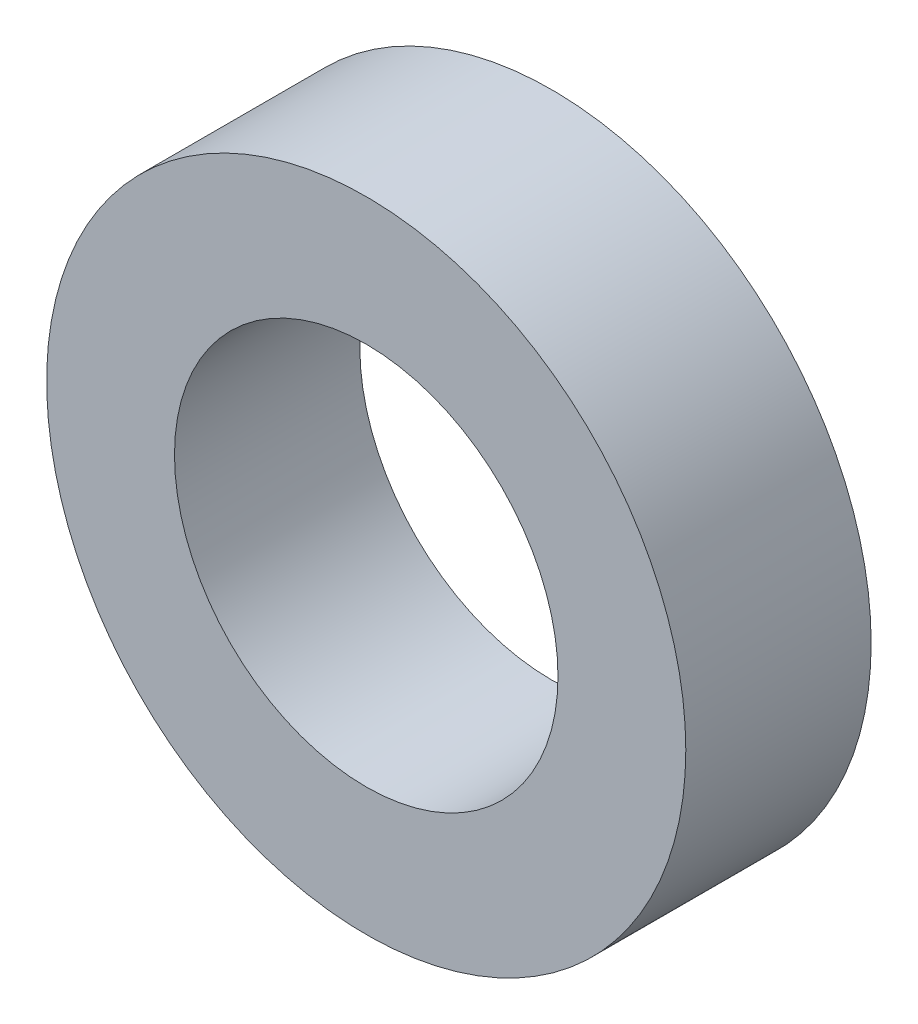
ISO-10303-21;
HEADER;
FILE_DESCRIPTION(('STEP AP214'),'2;1');
FILE_NAME('part.step','',(''),(''),'','','');
FILE_SCHEMA(('AUTOMOTIVE_DESIGN { 1 0 10303 214 1 1 1 1 }'));
ENDSEC;
DATA;
#1=APPLICATION_CONTEXT('core data for automotive mechanical design processes');
#2=APPLICATION_PROTOCOL_DEFINITION('international standard','automotive_design',2000,#1);
#3=PRODUCT_CONTEXT('',#1,'mechanical');
#4=PRODUCT('Part','Part','',(#3));
#5=PRODUCT_RELATED_PRODUCT_CATEGORY('part','',(#4));
#6=PRODUCT_DEFINITION_FORMATION('','',#4);
#7=PRODUCT_DEFINITION_CONTEXT('part definition',#1,'design');
#8=PRODUCT_DEFINITION('design','',#6,#7);
#9=PRODUCT_DEFINITION_SHAPE('','',#8);
#10=(LENGTH_UNIT() NAMED_UNIT(*) SI_UNIT(.MILLI.,.METRE.));
#11=(NAMED_UNIT(*) PLANE_ANGLE_UNIT() SI_UNIT($,.RADIAN.));
#12=(NAMED_UNIT(*) SI_UNIT($,.STERADIAN.) SOLID_ANGLE_UNIT());
#13=UNCERTAINTY_MEASURE_WITH_UNIT(LENGTH_MEASURE(1.E-05),#10,'distance_accuracy_value','');
#14=(GEOMETRIC_REPRESENTATION_CONTEXT(3) GLOBAL_UNCERTAINTY_ASSIGNED_CONTEXT((#13)) GLOBAL_UNIT_ASSIGNED_CONTEXT((#10,
#11,#12)) REPRESENTATION_CONTEXT('',''));
#15=CARTESIAN_POINT('',(0.,0.,0.));
#16=DIRECTION('',(0.,0.,1.));
#17=DIRECTION('',(1.,0.,0.));
#18=AXIS2_PLACEMENT_3D('',#15,#16,#17);
#19=CARTESIAN_POINT('',(0.,0.,2.9));
#20=DIRECTION('',(0.,0.,1.));
#21=DIRECTION('',(1.,0.,0.));
#22=AXIS2_PLACEMENT_3D('',#19,#20,#21);
#23=PLANE('',#22);
#24=CARTESIAN_POINT('',(0.,0.,2.9));
#25=DIRECTION('',(0.,0.,1.));
#26=DIRECTION('',(1.,0.,0.));
#27=AXIS2_PLACEMENT_3D('',#24,#25,#26);
#28=CIRCLE('',#27,5.);
#29=CARTESIAN_POINT('',(5.,0.,2.9));
#30=VERTEX_POINT('',#29);
#31=EDGE_CURVE('E10',#30,#30,#28,.T.);
#32=ORIENTED_EDGE('',*,*,#31,.T.);
#33=EDGE_LOOP('',(#32));
#34=FACE_BOUND('',#33,.T.);
#35=CARTESIAN_POINT('',(0.,0.,2.9));
#36=DIRECTION('',(0.,0.,1.));
#37=DIRECTION('',(1.,0.,0.));
#38=AXIS2_PLACEMENT_3D('',#35,#36,#37);
#39=CIRCLE('',#38,3.);
#40=CARTESIAN_POINT('',(3.,0.,2.9));
#41=VERTEX_POINT('',#40);
#42=EDGE_CURVE('E42',#41,#41,#39,.T.);
#43=ORIENTED_EDGE('',*,*,#42,.F.);
#44=EDGE_LOOP('',(#43));
#45=FACE_BOUND('',#44,.T.);
#46=ADVANCED_FACE('F31',(#34,#45),#23,.T.);
#47=CARTESIAN_POINT('',(0.,0.,0.));
#48=DIRECTION('',(0.,0.,1.));
#49=DIRECTION('',(1.,0.,0.));
#50=AXIS2_PLACEMENT_3D('',#47,#48,#49);
#51=PLANE('',#50);
#52=CARTESIAN_POINT('',(0.,0.,0.));
#53=DIRECTION('',(0.,0.,1.));
#54=DIRECTION('',(1.,0.,0.));
#55=AXIS2_PLACEMENT_3D('',#52,#53,#54);
#56=CIRCLE('',#55,5.);
#57=CARTESIAN_POINT('',(5.,0.,0.));
#58=VERTEX_POINT('',#57);
#59=EDGE_CURVE('E35',#58,#58,#56,.T.);
#60=ORIENTED_EDGE('',*,*,#59,.F.);
#61=EDGE_LOOP('',(#60));
#62=FACE_BOUND('',#61,.T.);
#63=CARTESIAN_POINT('',(0.,0.,0.));
#64=DIRECTION('',(0.,0.,1.));
#65=DIRECTION('',(1.,0.,0.));
#66=AXIS2_PLACEMENT_3D('',#63,#64,#65);
#67=CIRCLE('',#66,3.);
#68=CARTESIAN_POINT('',(3.,0.,0.));
#69=VERTEX_POINT('',#68);
#70=EDGE_CURVE('E44',#69,#69,#67,.T.);
#71=ORIENTED_EDGE('',*,*,#70,.T.);
#72=EDGE_LOOP('',(#71));
#73=FACE_BOUND('',#72,.T.);
#74=ADVANCED_FACE('F54',(#62,#73),#51,.F.);
#75=CARTESIAN_POINT('',(0.,0.,2.9));
#76=DIRECTION('',(0.,0.,-1.));
#77=DIRECTION('',(-1.,0.,0.));
#78=AXIS2_PLACEMENT_3D('',#75,#76,#77);
#79=CYLINDRICAL_SURFACE('',#78,5.);
#80=ORIENTED_EDGE('',*,*,#31,.F.);
#81=EDGE_LOOP('',(#80));
#82=FACE_BOUND('',#81,.T.);
#83=ORIENTED_EDGE('',*,*,#59,.T.);
#84=EDGE_LOOP('',(#83));
#85=FACE_BOUND('',#84,.T.);
#86=ADVANCED_FACE('F33',(#82,#85),#79,.T.);
#87=CARTESIAN_POINT('',(0.,0.,2.9));
#88=DIRECTION('',(0.,0.,-1.));
#89=DIRECTION('',(-1.,0.,0.));
#90=AXIS2_PLACEMENT_3D('',#87,#88,#89);
#91=CYLINDRICAL_SURFACE('',#90,3.);
#92=ORIENTED_EDGE('',*,*,#42,.T.);
#93=EDGE_LOOP('',(#92));
#94=FACE_BOUND('',#93,.T.);
#95=ORIENTED_EDGE('',*,*,#70,.F.);
#96=EDGE_LOOP('',(#95));
#97=FACE_BOUND('',#96,.T.);
#98=ADVANCED_FACE('F50',(#94,#97),#91,.F.);
#99=CLOSED_SHELL('',(#46,#74,#86,#98));
#100=MANIFOLD_SOLID_BREP('B2',#99);
#101=ADVANCED_BREP_SHAPE_REPRESENTATION('',(#18,#100),#14);
#102=SHAPE_DEFINITION_REPRESENTATION(#9,#101);
ENDSEC;
END-ISO-10303-21;
